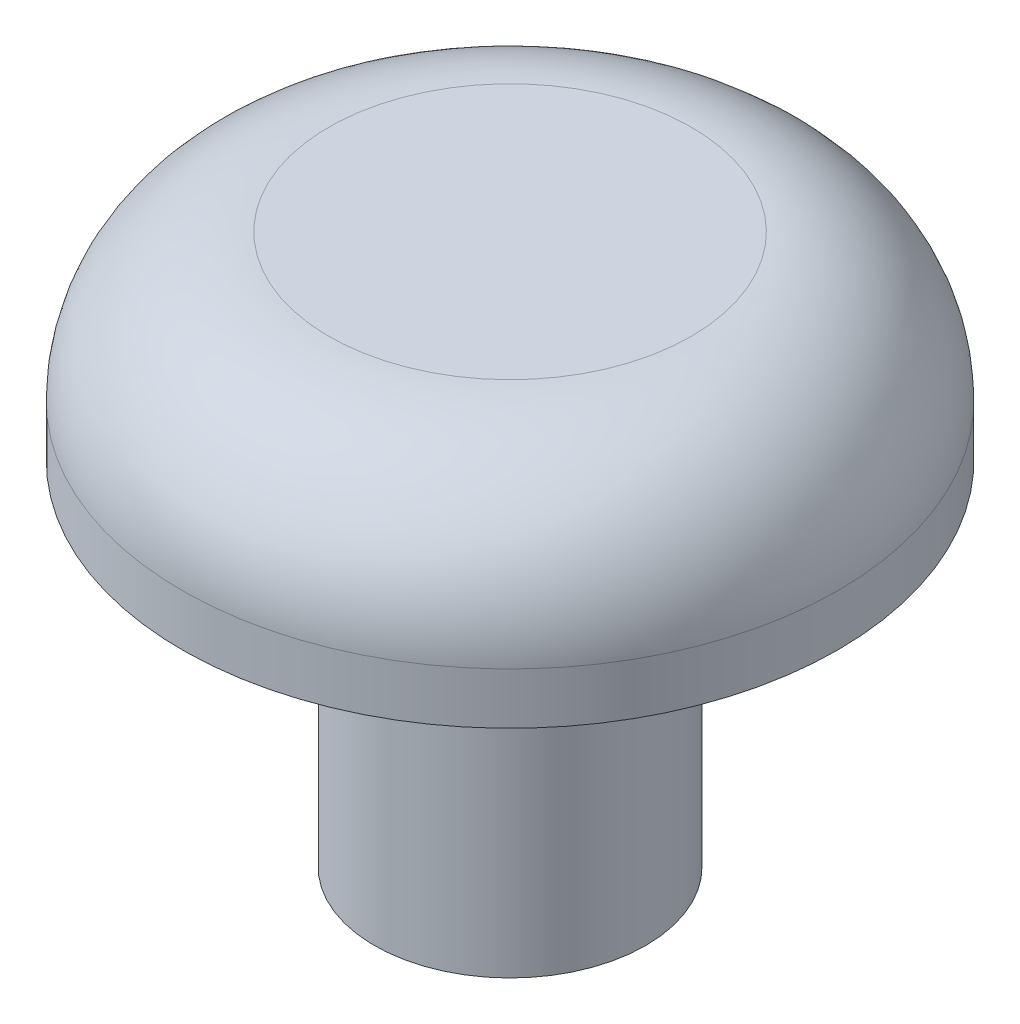
ISO-10303-21;
HEADER;
FILE_DESCRIPTION(('STEP AP214'),'2;1');
FILE_NAME('part.step','',(''),(''),'','','');
FILE_SCHEMA(('AUTOMOTIVE_DESIGN { 1 0 10303 214 1 1 1 1 }'));
ENDSEC;
DATA;
#1=APPLICATION_CONTEXT('core data for automotive mechanical design processes');
#2=APPLICATION_PROTOCOL_DEFINITION('international standard','automotive_design',2000,#1);
#3=PRODUCT_CONTEXT('',#1,'mechanical');
#4=PRODUCT('Part','Part','',(#3));
#5=PRODUCT_RELATED_PRODUCT_CATEGORY('part','',(#4));
#6=PRODUCT_DEFINITION_FORMATION('','',#4);
#7=PRODUCT_DEFINITION_CONTEXT('part definition',#1,'design');
#8=PRODUCT_DEFINITION('design','',#6,#7);
#9=PRODUCT_DEFINITION_SHAPE('','',#8);
#10=(LENGTH_UNIT() NAMED_UNIT(*) SI_UNIT(.MILLI.,.METRE.));
#11=(NAMED_UNIT(*) PLANE_ANGLE_UNIT() SI_UNIT($,.RADIAN.));
#12=(NAMED_UNIT(*) SI_UNIT($,.STERADIAN.) SOLID_ANGLE_UNIT());
#13=UNCERTAINTY_MEASURE_WITH_UNIT(LENGTH_MEASURE(1.E-05),#10,'distance_accuracy_value','');
#14=(GEOMETRIC_REPRESENTATION_CONTEXT(3) GLOBAL_UNCERTAINTY_ASSIGNED_CONTEXT((#13)) GLOBAL_UNIT_ASSIGNED_CONTEXT((#10,
#11,#12)) REPRESENTATION_CONTEXT('',''));
#15=CARTESIAN_POINT('',(0.,0.,0.));
#16=DIRECTION('',(0.,0.,1.));
#17=DIRECTION('',(1.,0.,0.));
#18=AXIS2_PLACEMENT_3D('',#15,#16,#17);
#19=CARTESIAN_POINT('',(0.,0.,0.));
#20=DIRECTION('',(0.,-1.,0.));
#21=DIRECTION('',(1.,0.,0.));
#22=AXIS2_PLACEMENT_3D('',#19,#20,#21);
#23=PLANE('',#22);
#24=CARTESIAN_POINT('',(0.,0.,0.));
#25=DIRECTION('',(0.,-1.,0.));
#26=DIRECTION('',(1.,0.,0.));
#27=AXIS2_PLACEMENT_3D('',#24,#25,#26);
#28=CIRCLE('',#27,3.1369);
#29=CARTESIAN_POINT('',(3.1369,0.,0.));
#30=VERTEX_POINT('',#29);
#31=EDGE_CURVE('E11',#30,#30,#28,.F.);
#32=ORIENTED_EDGE('',*,*,#31,.T.);
#33=EDGE_LOOP('',(#32));
#34=FACE_BOUND('',#33,.T.);
#35=ADVANCED_FACE('F36',(#34),#23,.F.);
#36=CARTESIAN_POINT('',(0.,-9.525,0.));
#37=DIRECTION('',(0.,-1.,0.));
#38=DIRECTION('',(1.,0.,0.));
#39=AXIS2_PLACEMENT_3D('',#36,#37,#38);
#40=CYLINDRICAL_SURFACE('',#39,5.6769);
#41=CARTESIAN_POINT('',(0.,-2.54,0.));
#42=DIRECTION('',(0.,-1.,0.));
#43=DIRECTION('',(1.,0.,0.));
#44=AXIS2_PLACEMENT_3D('',#41,#42,#43);
#45=CIRCLE('',#44,5.6769);
#46=CARTESIAN_POINT('',(5.6769,-2.54,0.));
#47=VERTEX_POINT('',#46);
#48=EDGE_CURVE('E43',#47,#47,#45,.T.);
#49=ORIENTED_EDGE('',*,*,#48,.T.);
#50=EDGE_LOOP('',(#49));
#51=FACE_BOUND('',#50,.T.);
#52=CARTESIAN_POINT('',(0.,-3.429,0.));
#53=DIRECTION('',(0.,-1.,0.));
#54=DIRECTION('',(1.,0.,0.));
#55=AXIS2_PLACEMENT_3D('',#52,#53,#54);
#56=CIRCLE('',#55,5.6769);
#57=CARTESIAN_POINT('',(5.6769,-3.429,0.));
#58=VERTEX_POINT('',#57);
#59=EDGE_CURVE('E66',#58,#58,#56,.T.);
#60=ORIENTED_EDGE('',*,*,#59,.F.);
#61=EDGE_LOOP('',(#60));
#62=FACE_BOUND('',#61,.T.);
#63=ADVANCED_FACE('F71',(#51,#62),#40,.T.);
#64=CARTESIAN_POINT('',(-5.6769,-3.429,0.));
#65=DIRECTION('',(0.,1.,0.));
#66=DIRECTION('',(-1.,0.,0.));
#67=AXIS2_PLACEMENT_3D('',#64,#65,#66);
#68=PLANE('',#67);
#69=CARTESIAN_POINT('',(0.,-3.429,0.));
#70=DIRECTION('',(0.,-1.,0.));
#71=DIRECTION('',(1.,0.,0.));
#72=AXIS2_PLACEMENT_3D('',#69,#70,#71);
#73=CIRCLE('',#72,2.34950000000001);
#74=CARTESIAN_POINT('',(2.34950000000001,-3.429,0.));
#75=VERTEX_POINT('',#74);
#76=EDGE_CURVE('E59',#75,#75,#73,.T.);
#77=ORIENTED_EDGE('',*,*,#76,.F.);
#78=EDGE_LOOP('',(#77));
#79=FACE_BOUND('',#78,.T.);
#80=ORIENTED_EDGE('',*,*,#59,.T.);
#81=EDGE_LOOP('',(#80));
#82=FACE_BOUND('',#81,.T.);
#83=ADVANCED_FACE('F89',(#79,#82),#68,.F.);
#84=CARTESIAN_POINT('',(0.,-9.525,0.));
#85=DIRECTION('',(0.,-1.,0.));
#86=DIRECTION('',(1.,0.,0.));
#87=AXIS2_PLACEMENT_3D('',#84,#85,#86);
#88=CYLINDRICAL_SURFACE('',#87,2.34950000000001);
#89=CARTESIAN_POINT('',(0.,-9.525,0.));
#90=DIRECTION('',(0.,-1.,0.));
#91=DIRECTION('',(1.,0.,0.));
#92=AXIS2_PLACEMENT_3D('',#89,#90,#91);
#93=CIRCLE('',#92,2.3495);
#94=CARTESIAN_POINT('',(2.3495,-9.525,0.));
#95=VERTEX_POINT('',#94);
#96=EDGE_CURVE('E55',#95,#95,#93,.T.);
#97=ORIENTED_EDGE('',*,*,#96,.F.);
#98=EDGE_LOOP('',(#97));
#99=FACE_BOUND('',#98,.T.);
#100=ORIENTED_EDGE('',*,*,#76,.T.);
#101=EDGE_LOOP('',(#100));
#102=FACE_BOUND('',#101,.T.);
#103=ADVANCED_FACE('F80',(#99,#102),#88,.T.);
#104=CARTESIAN_POINT('',(-2.3495,-9.525,0.));
#105=DIRECTION('',(0.,1.,0.));
#106=DIRECTION('',(-1.,0.,0.));
#107=AXIS2_PLACEMENT_3D('',#104,#105,#106);
#108=PLANE('',#107);
#109=CARTESIAN_POINT('',(0.,-9.525,0.));
#110=DIRECTION('',(0.,-1.,0.));
#111=DIRECTION('',(0.,0.,-1.));
#112=AXIS2_PLACEMENT_3D('',#109,#110,#111);
#113=CIRCLE('',#112,1.35255);
#114=CARTESIAN_POINT('',(0.,-9.525,-1.35255));
#115=VERTEX_POINT('',#114);
#116=EDGE_CURVE('E56',#115,#115,#113,.T.);
#117=ORIENTED_EDGE('',*,*,#116,.F.);
#118=EDGE_LOOP('',(#117));
#119=FACE_BOUND('',#118,.T.);
#120=ORIENTED_EDGE('',*,*,#96,.T.);
#121=EDGE_LOOP('',(#120));
#122=FACE_BOUND('',#121,.T.);
#123=ADVANCED_FACE('F75',(#119,#122),#108,.F.);
#124=CARTESIAN_POINT('',(0.,-2.54,0.));
#125=DIRECTION('',(0.,-1.,0.));
#126=DIRECTION('',(1.,0.,0.));
#127=AXIS2_PLACEMENT_3D('',#124,#125,#126);
#128=TOROIDAL_SURFACE('',#127,3.1369,2.54);
#129=ORIENTED_EDGE('',*,*,#31,.F.);
#130=EDGE_LOOP('',(#129));
#131=FACE_BOUND('',#130,.T.);
#132=ORIENTED_EDGE('',*,*,#48,.F.);
#133=EDGE_LOOP('',(#132));
#134=FACE_BOUND('',#133,.T.);
#135=ADVANCED_FACE('F38',(#131,#134),#128,.T.);
#136=CARTESIAN_POINT('',(0.,-3.6322,0.));
#137=DIRECTION('',(0.,-1.,0.));
#138=DIRECTION('',(0.,0.,-1.));
#139=AXIS2_PLACEMENT_3D('',#136,#137,#138);
#140=CONICAL_SURFACE('',#139,1.35255,1.02974425867665);
#141=CARTESIAN_POINT('',(0.,-2.81950596973427,0.));
#142=VERTEX_POINT('',#141);
#143=VERTEX_LOOP('',#142);
#144=FACE_BOUND('',#143,.T.);
#145=CARTESIAN_POINT('',(0.,-3.6322,0.));
#146=DIRECTION('',(0.,-1.,0.));
#147=DIRECTION('',(0.,0.,-1.));
#148=AXIS2_PLACEMENT_3D('',#145,#146,#147);
#149=CIRCLE('',#148,1.35255);
#150=CARTESIAN_POINT('',(0.,-3.6322,-1.35255));
#151=VERTEX_POINT('',#150);
#152=EDGE_CURVE('E53',#151,#151,#149,.T.);
#153=ORIENTED_EDGE('',*,*,#152,.T.);
#154=EDGE_LOOP('',(#153));
#155=FACE_BOUND('',#154,.T.);
#156=ADVANCED_FACE('F46',(#144,#155),#140,.F.);
#157=CARTESIAN_POINT('',(0.,-9.525,0.));
#158=DIRECTION('',(0.,-1.,0.));
#159=DIRECTION('',(0.,0.,-1.));
#160=AXIS2_PLACEMENT_3D('',#157,#158,#159);
#161=CYLINDRICAL_SURFACE('',#160,1.35255);
#162=ORIENTED_EDGE('',*,*,#152,.F.);
#163=EDGE_LOOP('',(#162));
#164=FACE_BOUND('',#163,.T.);
#165=ORIENTED_EDGE('',*,*,#116,.T.);
#166=EDGE_LOOP('',(#165));
#167=FACE_BOUND('',#166,.T.);
#168=ADVANCED_FACE('F49',(#164,#167),#161,.F.);
#169=CLOSED_SHELL('',(#35,#63,#83,#103,#123,#135,#156,#168));
#170=MANIFOLD_SOLID_BREP('B2',#169);
#171=ADVANCED_BREP_SHAPE_REPRESENTATION('',(#18,#170),#14);
#172=SHAPE_DEFINITION_REPRESENTATION(#9,#171);
ENDSEC;
END-ISO-10303-21;
